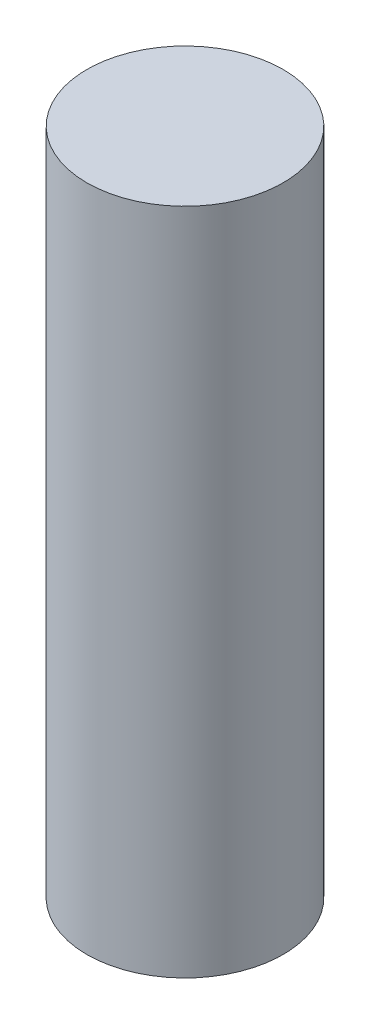
ISO-10303-21;
HEADER;
FILE_DESCRIPTION(('STEP AP214'),'2;1');
FILE_NAME('part.step','',(''),(''),'','','');
FILE_SCHEMA(('AUTOMOTIVE_DESIGN { 1 0 10303 214 1 1 1 1 }'));
ENDSEC;
DATA;
#1=APPLICATION_CONTEXT('core data for automotive mechanical design processes');
#2=APPLICATION_PROTOCOL_DEFINITION('international standard','automotive_design',2000,#1);
#3=PRODUCT_CONTEXT('',#1,'mechanical');
#4=PRODUCT('Part','Part','',(#3));
#5=PRODUCT_RELATED_PRODUCT_CATEGORY('part','',(#4));
#6=PRODUCT_DEFINITION_FORMATION('','',#4);
#7=PRODUCT_DEFINITION_CONTEXT('part definition',#1,'design');
#8=PRODUCT_DEFINITION('design','',#6,#7);
#9=PRODUCT_DEFINITION_SHAPE('','',#8);
#10=(LENGTH_UNIT() NAMED_UNIT(*) SI_UNIT(.MILLI.,.METRE.));
#11=(NAMED_UNIT(*) PLANE_ANGLE_UNIT() SI_UNIT($,.RADIAN.));
#12=(NAMED_UNIT(*) SI_UNIT($,.STERADIAN.) SOLID_ANGLE_UNIT());
#13=UNCERTAINTY_MEASURE_WITH_UNIT(LENGTH_MEASURE(1.E-05),#10,'distance_accuracy_value','');
#14=(GEOMETRIC_REPRESENTATION_CONTEXT(3) GLOBAL_UNCERTAINTY_ASSIGNED_CONTEXT((#13)) GLOBAL_UNIT_ASSIGNED_CONTEXT((#10,
#11,#12)) REPRESENTATION_CONTEXT('',''));
#15=CARTESIAN_POINT('',(0.,0.,0.));
#16=DIRECTION('',(0.,0.,1.));
#17=DIRECTION('',(1.,0.,0.));
#18=AXIS2_PLACEMENT_3D('',#15,#16,#17);
#19=CARTESIAN_POINT('',(0.,88.5,0.));
#20=DIRECTION('',(0.,-1.,0.));
#21=DIRECTION('',(0.,0.,-1.));
#22=AXIS2_PLACEMENT_3D('',#19,#20,#21);
#23=CYLINDRICAL_SURFACE('',#22,13.);
#24=CARTESIAN_POINT('',(0.,88.5,0.));
#25=DIRECTION('',(0.,1.,0.));
#26=DIRECTION('',(0.,0.,1.));
#27=AXIS2_PLACEMENT_3D('',#24,#25,#26);
#28=CIRCLE('',#27,13.);
#29=CARTESIAN_POINT('',(0.,88.5,13.));
#30=VERTEX_POINT('',#29);
#31=EDGE_CURVE('E10',#30,#30,#28,.T.);
#32=ORIENTED_EDGE('',*,*,#31,.F.);
#33=EDGE_LOOP('',(#32));
#34=FACE_BOUND('',#33,.T.);
#35=CARTESIAN_POINT('',(0.,0.,0.));
#36=DIRECTION('',(0.,1.,0.));
#37=DIRECTION('',(0.,0.,1.));
#38=AXIS2_PLACEMENT_3D('',#35,#36,#37);
#39=CIRCLE('',#38,13.);
#40=CARTESIAN_POINT('',(0.,0.,13.));
#41=VERTEX_POINT('',#40);
#42=EDGE_CURVE('E34',#41,#41,#39,.T.);
#43=ORIENTED_EDGE('',*,*,#42,.T.);
#44=EDGE_LOOP('',(#43));
#45=FACE_BOUND('',#44,.T.);
#46=ADVANCED_FACE('F31',(#34,#45),#23,.T.);
#47=CARTESIAN_POINT('',(0.,88.5,0.));
#48=DIRECTION('',(0.,1.,0.));
#49=DIRECTION('',(0.,0.,1.));
#50=AXIS2_PLACEMENT_3D('',#47,#48,#49);
#51=PLANE('',#50);
#52=ORIENTED_EDGE('',*,*,#31,.T.);
#53=EDGE_LOOP('',(#52));
#54=FACE_BOUND('',#53,.T.);
#55=ADVANCED_FACE('F46',(#54),#51,.T.);
#56=CARTESIAN_POINT('',(0.,0.,0.));
#57=DIRECTION('',(0.,1.,0.));
#58=DIRECTION('',(0.,0.,1.));
#59=AXIS2_PLACEMENT_3D('',#56,#57,#58);
#60=PLANE('',#59);
#61=ORIENTED_EDGE('',*,*,#42,.F.);
#62=EDGE_LOOP('',(#61));
#63=FACE_BOUND('',#62,.T.);
#64=ADVANCED_FACE('F44',(#63),#60,.F.);
#65=CLOSED_SHELL('',(#46,#55,#64));
#66=MANIFOLD_SOLID_BREP('B2',#65);
#67=ADVANCED_BREP_SHAPE_REPRESENTATION('',(#18,#66),#14);
#68=SHAPE_DEFINITION_REPRESENTATION(#9,#67);
ENDSEC;
END-ISO-10303-21;
